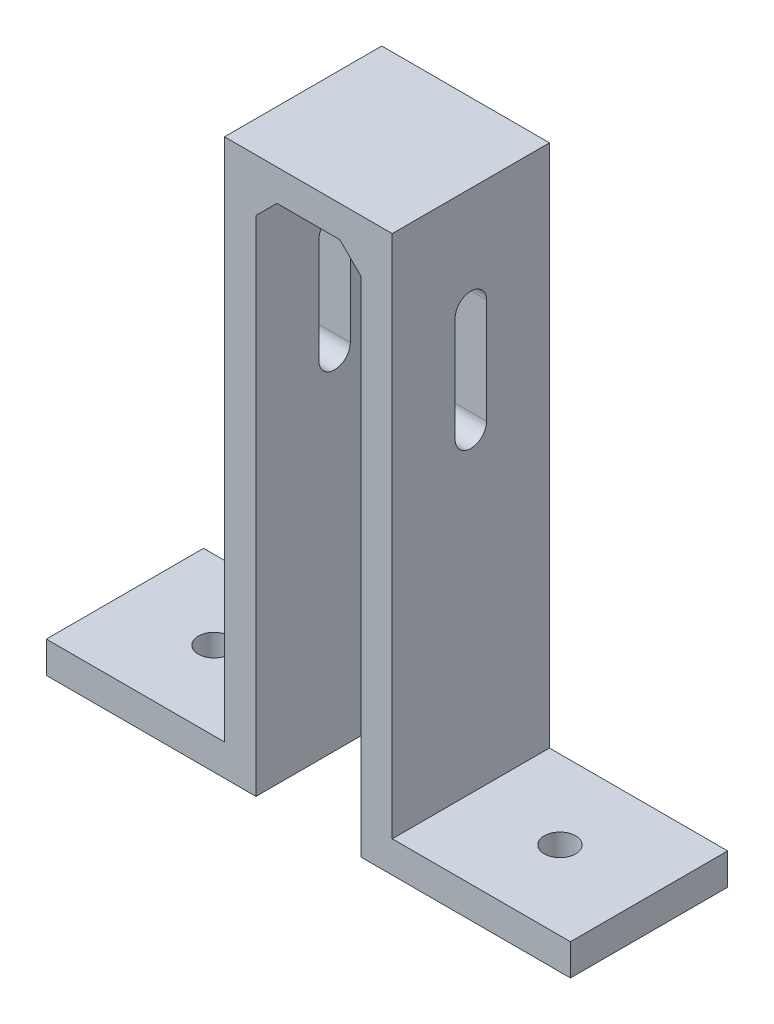
ISO-10303-21;
HEADER;
FILE_DESCRIPTION(('STEP AP214'),'2;1');
FILE_NAME('part.step','',(''),(''),'','','');
FILE_SCHEMA(('AUTOMOTIVE_DESIGN { 1 0 10303 214 1 1 1 1 }'));
ENDSEC;
DATA;
#1=APPLICATION_CONTEXT('core data for automotive mechanical design processes');
#2=APPLICATION_PROTOCOL_DEFINITION('international standard','automotive_design',2000,#1);
#3=PRODUCT_CONTEXT('',#1,'mechanical');
#4=PRODUCT('Part','Part','',(#3));
#5=PRODUCT_RELATED_PRODUCT_CATEGORY('part','',(#4));
#6=PRODUCT_DEFINITION_FORMATION('','',#4);
#7=PRODUCT_DEFINITION_CONTEXT('part definition',#1,'design');
#8=PRODUCT_DEFINITION('design','',#6,#7);
#9=PRODUCT_DEFINITION_SHAPE('','',#8);
#10=(LENGTH_UNIT() NAMED_UNIT(*) SI_UNIT(.MILLI.,.METRE.));
#11=(NAMED_UNIT(*) PLANE_ANGLE_UNIT() SI_UNIT($,.RADIAN.));
#12=(NAMED_UNIT(*) SI_UNIT($,.STERADIAN.) SOLID_ANGLE_UNIT());
#13=UNCERTAINTY_MEASURE_WITH_UNIT(LENGTH_MEASURE(1.E-05),#10,'distance_accuracy_value','');
#14=(GEOMETRIC_REPRESENTATION_CONTEXT(3) GLOBAL_UNCERTAINTY_ASSIGNED_CONTEXT((#13)) GLOBAL_UNIT_ASSIGNED_CONTEXT((#10,
#11,#12)) REPRESENTATION_CONTEXT('',''));
#15=CARTESIAN_POINT('',(0.,0.,0.));
#16=DIRECTION('',(0.,0.,1.));
#17=DIRECTION('',(1.,0.,0.));
#18=AXIS2_PLACEMENT_3D('',#15,#16,#17);
#19=CARTESIAN_POINT('',(0.,0.,15.));
#20=DIRECTION('',(0.,1.,0.));
#21=DIRECTION('',(-1.,0.,0.));
#22=AXIS2_PLACEMENT_3D('',#19,#20,#21);
#23=PLANE('',#22);
#24=CARTESIAN_POINT('',(-11.5,0.,7.5));
#25=DIRECTION('',(0.,1.,0.));
#26=DIRECTION('',(0.,0.,1.));
#27=AXIS2_PLACEMENT_3D('',#24,#25,#26);
#28=CIRCLE('',#27,1.5);
#29=CARTESIAN_POINT('',(-11.5,0.,9.));
#30=VERTEX_POINT('',#29);
#31=EDGE_CURVE('E221',#30,#30,#28,.T.);
#32=ORIENTED_EDGE('',*,*,#31,.T.);
#33=EDGE_LOOP('',(#32));
#34=FACE_BOUND('',#33,.T.);
#35=DIRECTION('',(1.,0.,0.));
#36=VECTOR('',#35,1.);
#37=CARTESIAN_POINT('',(0.,0.,0.));
#38=LINE('',#37,#36);
#39=CARTESIAN_POINT('',(-20.,0.,0.));
#40=VERTEX_POINT('',#39);
#41=CARTESIAN_POINT('',(0.,0.,0.));
#42=VERTEX_POINT('',#41);
#43=EDGE_CURVE('E303',#40,#42,#38,.T.);
#44=ORIENTED_EDGE('',*,*,#43,.T.);
#45=DIRECTION('',(0.,0.,-1.));
#46=VECTOR('',#45,1.);
#47=CARTESIAN_POINT('',(0.,0.,15.));
#48=LINE('',#47,#46);
#49=CARTESIAN_POINT('',(0.,0.,15.));
#50=VERTEX_POINT('',#49);
#51=EDGE_CURVE('E407',#50,#42,#48,.T.);
#52=ORIENTED_EDGE('',*,*,#51,.F.);
#53=DIRECTION('',(1.,0.,0.));
#54=VECTOR('',#53,1.);
#55=CARTESIAN_POINT('',(0.,0.,15.));
#56=LINE('',#55,#54);
#57=CARTESIAN_POINT('',(-20.,0.,15.));
#58=VERTEX_POINT('',#57);
#59=EDGE_CURVE('E304',#58,#50,#56,.T.);
#60=ORIENTED_EDGE('',*,*,#59,.F.);
#61=DIRECTION('',(0.,0.,-1.));
#62=VECTOR('',#61,1.);
#63=CARTESIAN_POINT('',(-20.,0.,15.));
#64=LINE('',#63,#62);
#65=EDGE_CURVE('E341',#58,#40,#64,.T.);
#66=ORIENTED_EDGE('',*,*,#65,.T.);
#67=EDGE_LOOP('',(#44,#52,#60,#66));
#68=FACE_BOUND('',#67,.T.);
#69=ADVANCED_FACE('F39',(#34,#68),#23,.F.);
#70=CARTESIAN_POINT('',(0.,0.,15.));
#71=DIRECTION('',(-1.,0.,0.));
#72=DIRECTION('',(0.,0.,1.));
#73=AXIS2_PLACEMENT_3D('',#70,#71,#72);
#74=PLANE('',#73);
#75=CARTESIAN_POINT('',(0.,33.,7.5));
#76=DIRECTION('',(-1.,0.,0.));
#77=DIRECTION('',(0.,0.,1.));
#78=AXIS2_PLACEMENT_3D('',#75,#76,#77);
#79=CIRCLE('',#78,1.5);
#80=CARTESIAN_POINT('',(0.,33.,6.));
#81=VERTEX_POINT('',#80);
#82=CARTESIAN_POINT('',(0.,33.,9.));
#83=VERTEX_POINT('',#82);
#84=EDGE_CURVE('E286',#81,#83,#79,.T.);
#85=ORIENTED_EDGE('',*,*,#84,.T.);
#86=DIRECTION('',(0.,1.,0.));
#87=VECTOR('',#86,1.);
#88=CARTESIAN_POINT('',(0.,0.,8.99999999999999));
#89=LINE('',#88,#87);
#90=CARTESIAN_POINT('',(0.,43.,9.));
#91=VERTEX_POINT('',#90);
#92=EDGE_CURVE('E278',#83,#91,#89,.T.);
#93=ORIENTED_EDGE('',*,*,#92,.T.);
#94=CARTESIAN_POINT('',(0.,43.,7.5));
#95=DIRECTION('',(-1.,0.,0.));
#96=DIRECTION('',(0.,0.,1.));
#97=AXIS2_PLACEMENT_3D('',#94,#95,#96);
#98=CIRCLE('',#97,1.5);
#99=CARTESIAN_POINT('',(0.,43.,6.));
#100=VERTEX_POINT('',#99);
#101=EDGE_CURVE('E299',#91,#100,#98,.T.);
#102=ORIENTED_EDGE('',*,*,#101,.T.);
#103=DIRECTION('',(0.,-1.,0.));
#104=VECTOR('',#103,1.);
#105=CARTESIAN_POINT('',(0.,0.,6.));
#106=LINE('',#105,#104);
#107=EDGE_CURVE('E266',#100,#81,#106,.T.);
#108=ORIENTED_EDGE('',*,*,#107,.T.);
#109=EDGE_LOOP('',(#85,#93,#102,#108));
#110=FACE_BOUND('',#109,.T.);
#111=DIRECTION('',(0.,1.,0.));
#112=VECTOR('',#111,1.);
#113=CARTESIAN_POINT('',(0.,0.,0.));
#114=LINE('',#113,#112);
#115=CARTESIAN_POINT('',(0.,48.,0.));
#116=VERTEX_POINT('',#115);
#117=EDGE_CURVE('E199',#42,#116,#114,.T.);
#118=ORIENTED_EDGE('',*,*,#117,.T.);
#119=DIRECTION('',(0.,0.,1.));
#120=VECTOR('',#119,1.);
#121=CARTESIAN_POINT('',(0.,48.,-2.82842712474619));
#122=LINE('',#121,#120);
#123=CARTESIAN_POINT('',(0.,48.,15.));
#124=VERTEX_POINT('',#123);
#125=EDGE_CURVE('E209',#116,#124,#122,.T.);
#126=ORIENTED_EDGE('',*,*,#125,.T.);
#127=DIRECTION('',(0.,1.,0.));
#128=VECTOR('',#127,1.);
#129=CARTESIAN_POINT('',(0.,0.,15.));
#130=LINE('',#129,#128);
#131=EDGE_CURVE('E308',#50,#124,#130,.T.);
#132=ORIENTED_EDGE('',*,*,#131,.F.);
#133=ORIENTED_EDGE('',*,*,#51,.T.);
#134=EDGE_LOOP('',(#118,#126,#132,#133));
#135=FACE_BOUND('',#134,.T.);
#136=ADVANCED_FACE('F454',(#110,#135),#74,.F.);
#137=CARTESIAN_POINT('',(0.,50.,15.));
#138=DIRECTION('',(0.,1.,0.));
#139=DIRECTION('',(0.,0.,1.));
#140=AXIS2_PLACEMENT_3D('',#137,#138,#139);
#141=PLANE('',#140);
#142=DIRECTION('',(1.,0.,0.));
#143=VECTOR('',#142,1.);
#144=CARTESIAN_POINT('',(0.,50.,0.));
#145=LINE('',#144,#143);
#146=CARTESIAN_POINT('',(2.,50.,0.));
#147=VERTEX_POINT('',#146);
#148=CARTESIAN_POINT('',(8.,50.,0.));
#149=VERTEX_POINT('',#148);
#150=EDGE_CURVE('E188',#147,#149,#145,.T.);
#151=ORIENTED_EDGE('',*,*,#150,.T.);
#152=DIRECTION('',(0.,0.,1.));
#153=VECTOR('',#152,1.);
#154=CARTESIAN_POINT('',(8.,50.,-2.82842712474619));
#155=LINE('',#154,#153);
#156=CARTESIAN_POINT('',(8.,50.,15.));
#157=VERTEX_POINT('',#156);
#158=EDGE_CURVE('E62',#149,#157,#155,.T.);
#159=ORIENTED_EDGE('',*,*,#158,.T.);
#160=DIRECTION('',(1.,0.,0.));
#161=VECTOR('',#160,1.);
#162=CARTESIAN_POINT('',(0.,50.,15.));
#163=LINE('',#162,#161);
#164=CARTESIAN_POINT('',(2.00000000000002,50.,15.));
#165=VERTEX_POINT('',#164);
#166=EDGE_CURVE('E204',#165,#157,#163,.T.);
#167=ORIENTED_EDGE('',*,*,#166,.F.);
#168=DIRECTION('',(0.,0.,1.));
#169=VECTOR('',#168,1.);
#170=CARTESIAN_POINT('',(2.,50.,-2.82842712474619));
#171=LINE('',#170,#169);
#172=EDGE_CURVE('E202',#147,#165,#171,.T.);
#173=ORIENTED_EDGE('',*,*,#172,.F.);
#174=EDGE_LOOP('',(#151,#159,#167,#173));
#175=FACE_BOUND('',#174,.T.);
#176=ADVANCED_FACE('F203',(#175),#141,.F.);
#177=CARTESIAN_POINT('',(10.,50.,15.));
#178=DIRECTION('',(1.,0.,0.));
#179=DIRECTION('',(0.,1.,0.));
#180=AXIS2_PLACEMENT_3D('',#177,#178,#179);
#181=PLANE('',#180);
#182=CARTESIAN_POINT('',(10.,43.,7.5));
#183=DIRECTION('',(1.,0.,0.));
#184=DIRECTION('',(0.,1.,0.));
#185=AXIS2_PLACEMENT_3D('',#182,#183,#184);
#186=CIRCLE('',#185,1.5);
#187=CARTESIAN_POINT('',(10.,43.,6.));
#188=VERTEX_POINT('',#187);
#189=CARTESIAN_POINT('',(10.,43.,9.));
#190=VERTEX_POINT('',#189);
#191=EDGE_CURVE('E295',#188,#190,#186,.T.);
#192=ORIENTED_EDGE('',*,*,#191,.T.);
#193=DIRECTION('',(0.,-1.,0.));
#194=VECTOR('',#193,1.);
#195=CARTESIAN_POINT('',(10.,50.,9.));
#196=LINE('',#195,#194);
#197=CARTESIAN_POINT('',(10.,33.,9.));
#198=VERTEX_POINT('',#197);
#199=EDGE_CURVE('E274',#190,#198,#196,.T.);
#200=ORIENTED_EDGE('',*,*,#199,.T.);
#201=CARTESIAN_POINT('',(10.,33.,7.5));
#202=DIRECTION('',(1.,0.,0.));
#203=DIRECTION('',(0.,1.,0.));
#204=AXIS2_PLACEMENT_3D('',#201,#202,#203);
#205=CIRCLE('',#204,1.5);
#206=CARTESIAN_POINT('',(10.,33.,6.));
#207=VERTEX_POINT('',#206);
#208=EDGE_CURVE('E282',#198,#207,#205,.T.);
#209=ORIENTED_EDGE('',*,*,#208,.T.);
#210=DIRECTION('',(0.,1.,0.));
#211=VECTOR('',#210,1.);
#212=CARTESIAN_POINT('',(10.,50.,6.));
#213=LINE('',#212,#211);
#214=EDGE_CURVE('E262',#207,#188,#213,.T.);
#215=ORIENTED_EDGE('',*,*,#214,.T.);
#216=EDGE_LOOP('',(#192,#200,#209,#215));
#217=FACE_BOUND('',#216,.T.);
#218=DIRECTION('',(0.,-1.,0.));
#219=VECTOR('',#218,1.);
#220=CARTESIAN_POINT('',(10.,50.,15.));
#221=LINE('',#220,#219);
#222=CARTESIAN_POINT('',(9.99999999999999,48.,15.));
#223=VERTEX_POINT('',#222);
#224=CARTESIAN_POINT('',(10.,0.,15.));
#225=VERTEX_POINT('',#224);
#226=EDGE_CURVE('E54',#223,#225,#221,.T.);
#227=ORIENTED_EDGE('',*,*,#226,.F.);
#228=DIRECTION('',(0.,0.,1.));
#229=VECTOR('',#228,1.);
#230=CARTESIAN_POINT('',(10.,48.,-2.82842712474619));
#231=LINE('',#230,#229);
#232=CARTESIAN_POINT('',(9.99999999999999,48.,0.));
#233=VERTEX_POINT('',#232);
#234=EDGE_CURVE('E510',#233,#223,#231,.T.);
#235=ORIENTED_EDGE('',*,*,#234,.F.);
#236=DIRECTION('',(0.,-1.,0.));
#237=VECTOR('',#236,1.);
#238=CARTESIAN_POINT('',(10.,50.,0.));
#239=LINE('',#238,#237);
#240=CARTESIAN_POINT('',(10.,0.,0.));
#241=VERTEX_POINT('',#240);
#242=EDGE_CURVE('E198',#233,#241,#239,.T.);
#243=ORIENTED_EDGE('',*,*,#242,.T.);
#244=DIRECTION('',(0.,0.,-1.));
#245=VECTOR('',#244,1.);
#246=CARTESIAN_POINT('',(10.,0.,15.));
#247=LINE('',#246,#245);
#248=EDGE_CURVE('E403',#225,#241,#247,.T.);
#249=ORIENTED_EDGE('',*,*,#248,.F.);
#250=EDGE_LOOP('',(#227,#235,#243,#249));
#251=FACE_BOUND('',#250,.T.);
#252=ADVANCED_FACE('F426',(#217,#251),#181,.F.);
#253=CARTESIAN_POINT('',(10.,0.,15.));
#254=DIRECTION('',(0.,1.,0.));
#255=DIRECTION('',(0.,0.,1.));
#256=AXIS2_PLACEMENT_3D('',#253,#254,#255);
#257=PLANE('',#256);
#258=CARTESIAN_POINT('',(21.5,0.,7.5));
#259=DIRECTION('',(0.,1.,0.));
#260=DIRECTION('',(0.,0.,1.));
#261=AXIS2_PLACEMENT_3D('',#258,#259,#260);
#262=CIRCLE('',#261,1.5);
#263=CARTESIAN_POINT('',(21.5,0.,9.));
#264=VERTEX_POINT('',#263);
#265=EDGE_CURVE('E217',#264,#264,#262,.T.);
#266=ORIENTED_EDGE('',*,*,#265,.T.);
#267=EDGE_LOOP('',(#266));
#268=FACE_BOUND('',#267,.T.);
#269=DIRECTION('',(1.,0.,0.));
#270=VECTOR('',#269,1.);
#271=CARTESIAN_POINT('',(10.,0.,0.));
#272=LINE('',#271,#270);
#273=CARTESIAN_POINT('',(30.,0.,0.));
#274=VERTEX_POINT('',#273);
#275=EDGE_CURVE('E349',#241,#274,#272,.T.);
#276=ORIENTED_EDGE('',*,*,#275,.T.);
#277=DIRECTION('',(0.,0.,-1.));
#278=VECTOR('',#277,1.);
#279=CARTESIAN_POINT('',(30.,0.,15.));
#280=LINE('',#279,#278);
#281=CARTESIAN_POINT('',(30.,0.,15.));
#282=VERTEX_POINT('',#281);
#283=EDGE_CURVE('E399',#282,#274,#280,.T.);
#284=ORIENTED_EDGE('',*,*,#283,.F.);
#285=DIRECTION('',(1.,0.,0.));
#286=VECTOR('',#285,1.);
#287=CARTESIAN_POINT('',(10.,0.,15.));
#288=LINE('',#287,#286);
#289=EDGE_CURVE('E317',#225,#282,#288,.T.);
#290=ORIENTED_EDGE('',*,*,#289,.F.);
#291=ORIENTED_EDGE('',*,*,#248,.T.);
#292=EDGE_LOOP('',(#276,#284,#290,#291));
#293=FACE_BOUND('',#292,.T.);
#294=ADVANCED_FACE('F506',(#268,#293),#257,.F.);
#295=CARTESIAN_POINT('',(30.,3.,15.));
#296=DIRECTION('',(-1.,0.,0.));
#297=DIRECTION('',(0.,0.,1.));
#298=AXIS2_PLACEMENT_3D('',#295,#296,#297);
#299=PLANE('',#298);
#300=DIRECTION('',(0.,1.,0.));
#301=VECTOR('',#300,1.);
#302=CARTESIAN_POINT('',(30.,3.,0.));
#303=LINE('',#302,#301);
#304=CARTESIAN_POINT('',(30.,3.,0.));
#305=VERTEX_POINT('',#304);
#306=EDGE_CURVE('E352',#274,#305,#303,.T.);
#307=ORIENTED_EDGE('',*,*,#306,.T.);
#308=DIRECTION('',(0.,0.,-1.));
#309=VECTOR('',#308,1.);
#310=CARTESIAN_POINT('',(30.,3.,15.));
#311=LINE('',#310,#309);
#312=CARTESIAN_POINT('',(30.,3.,15.));
#313=VERTEX_POINT('',#312);
#314=EDGE_CURVE('E395',#313,#305,#311,.T.);
#315=ORIENTED_EDGE('',*,*,#314,.F.);
#316=DIRECTION('',(0.,1.,0.));
#317=VECTOR('',#316,1.);
#318=CARTESIAN_POINT('',(30.,3.,15.));
#319=LINE('',#318,#317);
#320=EDGE_CURVE('E320',#282,#313,#319,.T.);
#321=ORIENTED_EDGE('',*,*,#320,.F.);
#322=ORIENTED_EDGE('',*,*,#283,.T.);
#323=EDGE_LOOP('',(#307,#315,#321,#322));
#324=FACE_BOUND('',#323,.T.);
#325=ADVANCED_FACE('F502',(#324),#299,.F.);
#326=CARTESIAN_POINT('',(13.,3.,15.));
#327=DIRECTION('',(0.,-1.,0.));
#328=DIRECTION('',(0.,0.,-1.));
#329=AXIS2_PLACEMENT_3D('',#326,#327,#328);
#330=PLANE('',#329);
#331=CARTESIAN_POINT('',(21.5,3.,7.5));
#332=DIRECTION('',(0.,1.,0.));
#333=DIRECTION('',(0.,0.,1.));
#334=AXIS2_PLACEMENT_3D('',#331,#332,#333);
#335=CIRCLE('',#334,1.5);
#336=CARTESIAN_POINT('',(21.5,3.,9.));
#337=VERTEX_POINT('',#336);
#338=EDGE_CURVE('E213',#337,#337,#335,.T.);
#339=ORIENTED_EDGE('',*,*,#338,.F.);
#340=EDGE_LOOP('',(#339));
#341=FACE_BOUND('',#340,.T.);
#342=DIRECTION('',(-1.,0.,0.));
#343=VECTOR('',#342,1.);
#344=CARTESIAN_POINT('',(13.,3.,0.));
#345=LINE('',#344,#343);
#346=CARTESIAN_POINT('',(13.,3.,0.));
#347=VERTEX_POINT('',#346);
#348=EDGE_CURVE('E355',#305,#347,#345,.T.);
#349=ORIENTED_EDGE('',*,*,#348,.T.);
#350=DIRECTION('',(0.,0.,-1.));
#351=VECTOR('',#350,1.);
#352=CARTESIAN_POINT('',(13.,3.,15.));
#353=LINE('',#352,#351);
#354=CARTESIAN_POINT('',(13.,3.,15.));
#355=VERTEX_POINT('',#354);
#356=EDGE_CURVE('E391',#355,#347,#353,.T.);
#357=ORIENTED_EDGE('',*,*,#356,.F.);
#358=DIRECTION('',(-1.,0.,0.));
#359=VECTOR('',#358,1.);
#360=CARTESIAN_POINT('',(13.,3.,15.));
#361=LINE('',#360,#359);
#362=EDGE_CURVE('E323',#313,#355,#361,.T.);
#363=ORIENTED_EDGE('',*,*,#362,.F.);
#364=ORIENTED_EDGE('',*,*,#314,.T.);
#365=EDGE_LOOP('',(#349,#357,#363,#364));
#366=FACE_BOUND('',#365,.T.);
#367=ADVANCED_FACE('F497',(#341,#366),#330,.F.);
#368=CARTESIAN_POINT('',(13.,53.,15.));
#369=DIRECTION('',(-1.,0.,0.));
#370=DIRECTION('',(0.,-1.,0.));
#371=AXIS2_PLACEMENT_3D('',#368,#369,#370);
#372=PLANE('',#371);
#373=CARTESIAN_POINT('',(13.,33.,7.5));
#374=DIRECTION('',(1.,0.,0.));
#375=DIRECTION('',(0.,1.,0.));
#376=AXIS2_PLACEMENT_3D('',#373,#374,#375);
#377=CIRCLE('',#376,1.5);
#378=CARTESIAN_POINT('',(13.,33.,9.));
#379=VERTEX_POINT('',#378);
#380=CARTESIAN_POINT('',(13.,33.,6.));
#381=VERTEX_POINT('',#380);
#382=EDGE_CURVE('E236',#379,#381,#377,.T.);
#383=ORIENTED_EDGE('',*,*,#382,.F.);
#384=DIRECTION('',(0.,-1.,0.));
#385=VECTOR('',#384,1.);
#386=CARTESIAN_POINT('',(13.,0.,8.99999999999999));
#387=LINE('',#386,#385);
#388=CARTESIAN_POINT('',(13.,43.,9.));
#389=VERTEX_POINT('',#388);
#390=EDGE_CURVE('E225',#389,#379,#387,.T.);
#391=ORIENTED_EDGE('',*,*,#390,.F.);
#392=CARTESIAN_POINT('',(13.,43.,7.5));
#393=DIRECTION('',(1.,0.,0.));
#394=DIRECTION('',(0.,1.,0.));
#395=AXIS2_PLACEMENT_3D('',#392,#393,#394);
#396=CIRCLE('',#395,1.5);
#397=CARTESIAN_POINT('',(13.,43.,6.));
#398=VERTEX_POINT('',#397);
#399=EDGE_CURVE('E290',#398,#389,#396,.T.);
#400=ORIENTED_EDGE('',*,*,#399,.F.);
#401=DIRECTION('',(0.,1.,0.));
#402=VECTOR('',#401,1.);
#403=CARTESIAN_POINT('',(13.,0.,6.));
#404=LINE('',#403,#402);
#405=EDGE_CURVE('E240',#381,#398,#404,.T.);
#406=ORIENTED_EDGE('',*,*,#405,.F.);
#407=EDGE_LOOP('',(#383,#391,#400,#406));
#408=FACE_BOUND('',#407,.T.);
#409=DIRECTION('',(0.,1.,0.));
#410=VECTOR('',#409,1.);
#411=CARTESIAN_POINT('',(13.,53.,0.));
#412=LINE('',#411,#410);
#413=CARTESIAN_POINT('',(13.,53.,0.));
#414=VERTEX_POINT('',#413);
#415=EDGE_CURVE('E358',#347,#414,#412,.T.);
#416=ORIENTED_EDGE('',*,*,#415,.T.);
#417=DIRECTION('',(0.,0.,-1.));
#418=VECTOR('',#417,1.);
#419=CARTESIAN_POINT('',(13.,53.,15.));
#420=LINE('',#419,#418);
#421=CARTESIAN_POINT('',(13.,53.,15.));
#422=VERTEX_POINT('',#421);
#423=EDGE_CURVE('E387',#422,#414,#420,.T.);
#424=ORIENTED_EDGE('',*,*,#423,.F.);
#425=DIRECTION('',(0.,1.,0.));
#426=VECTOR('',#425,1.);
#427=CARTESIAN_POINT('',(13.,53.,15.));
#428=LINE('',#427,#426);
#429=EDGE_CURVE('E326',#355,#422,#428,.T.);
#430=ORIENTED_EDGE('',*,*,#429,.F.);
#431=ORIENTED_EDGE('',*,*,#356,.T.);
#432=EDGE_LOOP('',(#416,#424,#430,#431));
#433=FACE_BOUND('',#432,.T.);
#434=ADVANCED_FACE('F436',(#408,#433),#372,.F.);
#435=CARTESIAN_POINT('',(-3.,53.,15.));
#436=DIRECTION('',(0.,-1.,0.));
#437=DIRECTION('',(0.,0.,-1.));
#438=AXIS2_PLACEMENT_3D('',#435,#436,#437);
#439=PLANE('',#438);
#440=DIRECTION('',(-1.,0.,0.));
#441=VECTOR('',#440,1.);
#442=CARTESIAN_POINT('',(-3.,53.,0.));
#443=LINE('',#442,#441);
#444=CARTESIAN_POINT('',(-3.,53.,0.));
#445=VERTEX_POINT('',#444);
#446=EDGE_CURVE('E361',#414,#445,#443,.T.);
#447=ORIENTED_EDGE('',*,*,#446,.T.);
#448=DIRECTION('',(0.,0.,-1.));
#449=VECTOR('',#448,1.);
#450=CARTESIAN_POINT('',(-3.,53.,15.));
#451=LINE('',#450,#449);
#452=CARTESIAN_POINT('',(-3.,53.,15.));
#453=VERTEX_POINT('',#452);
#454=EDGE_CURVE('E383',#453,#445,#451,.T.);
#455=ORIENTED_EDGE('',*,*,#454,.F.);
#456=DIRECTION('',(-1.,0.,0.));
#457=VECTOR('',#456,1.);
#458=CARTESIAN_POINT('',(-3.,53.,15.));
#459=LINE('',#458,#457);
#460=EDGE_CURVE('E329',#422,#453,#459,.T.);
#461=ORIENTED_EDGE('',*,*,#460,.F.);
#462=ORIENTED_EDGE('',*,*,#423,.T.);
#463=EDGE_LOOP('',(#447,#455,#461,#462));
#464=FACE_BOUND('',#463,.T.);
#465=ADVANCED_FACE('F489',(#464),#439,.F.);
#466=CARTESIAN_POINT('',(-3.,3.,15.));
#467=DIRECTION('',(1.,0.,0.));
#468=DIRECTION('',(0.,0.,-1.));
#469=AXIS2_PLACEMENT_3D('',#466,#467,#468);
#470=PLANE('',#469);
#471=CARTESIAN_POINT('',(-3.,43.,7.5));
#472=DIRECTION('',(1.,0.,0.));
#473=DIRECTION('',(0.,0.,-1.));
#474=AXIS2_PLACEMENT_3D('',#471,#472,#473);
#475=CIRCLE('',#474,1.5);
#476=CARTESIAN_POINT('',(-3.,43.,6.));
#477=VERTEX_POINT('',#476);
#478=CARTESIAN_POINT('',(-3.,43.,9.));
#479=VERTEX_POINT('',#478);
#480=EDGE_CURVE('E294',#477,#479,#475,.T.);
#481=ORIENTED_EDGE('',*,*,#480,.T.);
#482=DIRECTION('',(0.,-1.,0.));
#483=VECTOR('',#482,1.);
#484=CARTESIAN_POINT('',(-3.,3.,8.99999999999999));
#485=LINE('',#484,#483);
#486=CARTESIAN_POINT('',(-3.,33.,9.));
#487=VERTEX_POINT('',#486);
#488=EDGE_CURVE('E270',#479,#487,#485,.T.);
#489=ORIENTED_EDGE('',*,*,#488,.T.);
#490=CARTESIAN_POINT('',(-3.,33.,7.5));
#491=DIRECTION('',(1.,0.,0.));
#492=DIRECTION('',(0.,0.,-1.));
#493=AXIS2_PLACEMENT_3D('',#490,#491,#492);
#494=CIRCLE('',#493,1.5);
#495=CARTESIAN_POINT('',(-3.,33.,6.));
#496=VERTEX_POINT('',#495);
#497=EDGE_CURVE('E11',#487,#496,#494,.T.);
#498=ORIENTED_EDGE('',*,*,#497,.T.);
#499=DIRECTION('',(0.,1.,0.));
#500=VECTOR('',#499,1.);
#501=CARTESIAN_POINT('',(-3.,3.,6.));
#502=LINE('',#501,#500);
#503=EDGE_CURVE('E247',#496,#477,#502,.T.);
#504=ORIENTED_EDGE('',*,*,#503,.T.);
#505=EDGE_LOOP('',(#481,#489,#498,#504));
#506=FACE_BOUND('',#505,.T.);
#507=DIRECTION('',(0.,-1.,0.));
#508=VECTOR('',#507,1.);
#509=CARTESIAN_POINT('',(-3.,3.,0.));
#510=LINE('',#509,#508);
#511=CARTESIAN_POINT('',(-3.,3.,0.));
#512=VERTEX_POINT('',#511);
#513=EDGE_CURVE('E364',#445,#512,#510,.T.);
#514=ORIENTED_EDGE('',*,*,#513,.T.);
#515=DIRECTION('',(0.,0.,-1.));
#516=VECTOR('',#515,1.);
#517=CARTESIAN_POINT('',(-3.,3.,15.));
#518=LINE('',#517,#516);
#519=CARTESIAN_POINT('',(-3.,3.,15.));
#520=VERTEX_POINT('',#519);
#521=EDGE_CURVE('E379',#520,#512,#518,.T.);
#522=ORIENTED_EDGE('',*,*,#521,.F.);
#523=DIRECTION('',(0.,-1.,0.));
#524=VECTOR('',#523,1.);
#525=CARTESIAN_POINT('',(-3.,3.,15.));
#526=LINE('',#525,#524);
#527=EDGE_CURVE('E332',#453,#520,#526,.T.);
#528=ORIENTED_EDGE('',*,*,#527,.F.);
#529=ORIENTED_EDGE('',*,*,#454,.T.);
#530=EDGE_LOOP('',(#514,#522,#528,#529));
#531=FACE_BOUND('',#530,.T.);
#532=ADVANCED_FACE('F484',(#506,#531),#470,.F.);
#533=CARTESIAN_POINT('',(-3.,3.,15.));
#534=DIRECTION('',(0.,-1.,0.));
#535=DIRECTION('',(0.,0.,-1.));
#536=AXIS2_PLACEMENT_3D('',#533,#534,#535);
#537=PLANE('',#536);
#538=CARTESIAN_POINT('',(-11.5,3.,7.5));
#539=DIRECTION('',(0.,1.,0.));
#540=DIRECTION('',(0.,0.,1.));
#541=AXIS2_PLACEMENT_3D('',#538,#539,#540);
#542=CIRCLE('',#541,1.5);
#543=CARTESIAN_POINT('',(-11.5,3.,9.));
#544=VERTEX_POINT('',#543);
#545=EDGE_CURVE('E226',#544,#544,#542,.T.);
#546=ORIENTED_EDGE('',*,*,#545,.F.);
#547=EDGE_LOOP('',(#546));
#548=FACE_BOUND('',#547,.T.);
#549=DIRECTION('',(-1.,0.,0.));
#550=VECTOR('',#549,1.);
#551=CARTESIAN_POINT('',(-3.,3.,0.));
#552=LINE('',#551,#550);
#553=CARTESIAN_POINT('',(-20.,3.,0.));
#554=VERTEX_POINT('',#553);
#555=EDGE_CURVE('E367',#512,#554,#552,.T.);
#556=ORIENTED_EDGE('',*,*,#555,.T.);
#557=DIRECTION('',(0.,0.,-1.));
#558=VECTOR('',#557,1.);
#559=CARTESIAN_POINT('',(-20.,3.,15.));
#560=LINE('',#559,#558);
#561=CARTESIAN_POINT('',(-20.,3.,15.));
#562=VERTEX_POINT('',#561);
#563=EDGE_CURVE('E375',#562,#554,#560,.T.);
#564=ORIENTED_EDGE('',*,*,#563,.F.);
#565=DIRECTION('',(-1.,0.,0.));
#566=VECTOR('',#565,1.);
#567=CARTESIAN_POINT('',(-3.,3.,15.));
#568=LINE('',#567,#566);
#569=EDGE_CURVE('E335',#520,#562,#568,.T.);
#570=ORIENTED_EDGE('',*,*,#569,.F.);
#571=ORIENTED_EDGE('',*,*,#521,.T.);
#572=EDGE_LOOP('',(#556,#564,#570,#571));
#573=FACE_BOUND('',#572,.T.);
#574=ADVANCED_FACE('F478',(#548,#573),#537,.F.);
#575=CARTESIAN_POINT('',(-20.,3.,15.));
#576=DIRECTION('',(1.,0.,0.));
#577=DIRECTION('',(0.,0.,-1.));
#578=AXIS2_PLACEMENT_3D('',#575,#576,#577);
#579=PLANE('',#578);
#580=DIRECTION('',(0.,-1.,0.));
#581=VECTOR('',#580,1.);
#582=CARTESIAN_POINT('',(-20.,3.,0.));
#583=LINE('',#582,#581);
#584=EDGE_CURVE('E309',#554,#40,#583,.T.);
#585=ORIENTED_EDGE('',*,*,#584,.T.);
#586=ORIENTED_EDGE('',*,*,#65,.F.);
#587=DIRECTION('',(0.,-1.,0.));
#588=VECTOR('',#587,1.);
#589=CARTESIAN_POINT('',(-20.,3.,15.));
#590=LINE('',#589,#588);
#591=EDGE_CURVE('E338',#562,#58,#590,.T.);
#592=ORIENTED_EDGE('',*,*,#591,.F.);
#593=ORIENTED_EDGE('',*,*,#563,.T.);
#594=EDGE_LOOP('',(#585,#586,#592,#593));
#595=FACE_BOUND('',#594,.T.);
#596=ADVANCED_FACE('F476',(#595),#579,.F.);
#597=CARTESIAN_POINT('',(0.,0.,15.));
#598=DIRECTION('',(0.,0.,1.));
#599=DIRECTION('',(1.,0.,0.));
#600=AXIS2_PLACEMENT_3D('',#597,#598,#599);
#601=PLANE('',#600);
#602=DIRECTION('',(0.707106781186547,-0.707106781186548,0.));
#603=VECTOR('',#602,1.);
#604=CARTESIAN_POINT('',(8.,50.,15.));
#605=LINE('',#604,#603);
#606=EDGE_CURVE('E519',#157,#223,#605,.T.);
#607=ORIENTED_EDGE('',*,*,#606,.T.);
#608=ORIENTED_EDGE('',*,*,#226,.T.);
#609=ORIENTED_EDGE('',*,*,#289,.T.);
#610=ORIENTED_EDGE('',*,*,#320,.T.);
#611=ORIENTED_EDGE('',*,*,#362,.T.);
#612=ORIENTED_EDGE('',*,*,#429,.T.);
#613=ORIENTED_EDGE('',*,*,#460,.T.);
#614=ORIENTED_EDGE('',*,*,#527,.T.);
#615=ORIENTED_EDGE('',*,*,#569,.T.);
#616=ORIENTED_EDGE('',*,*,#591,.T.);
#617=ORIENTED_EDGE('',*,*,#59,.T.);
#618=ORIENTED_EDGE('',*,*,#131,.T.);
#619=DIRECTION('',(0.707106781186547,0.707106781186548,0.));
#620=VECTOR('',#619,1.);
#621=CARTESIAN_POINT('',(2.,50.,15.));
#622=LINE('',#621,#620);
#623=EDGE_CURVE('E512',#124,#165,#622,.T.);
#624=ORIENTED_EDGE('',*,*,#623,.T.);
#625=ORIENTED_EDGE('',*,*,#166,.T.);
#626=EDGE_LOOP('',(#607,#608,#609,#610,#611,#612,#613,#614,#615,#616,#617,#618,#624,#625));
#627=FACE_BOUND('',#626,.T.);
#628=ADVANCED_FACE('F471',(#627),#601,.T.);
#629=CARTESIAN_POINT('',(0.,0.,0.));
#630=DIRECTION('',(0.,0.,1.));
#631=DIRECTION('',(1.,0.,0.));
#632=AXIS2_PLACEMENT_3D('',#629,#630,#631);
#633=PLANE('',#632);
#634=ORIENTED_EDGE('',*,*,#242,.F.);
#635=DIRECTION('',(-0.707106781186547,0.707106781186548,0.));
#636=VECTOR('',#635,1.);
#637=CARTESIAN_POINT('',(8.,50.,0.));
#638=LINE('',#637,#636);
#639=EDGE_CURVE('E196',#233,#149,#638,.T.);
#640=ORIENTED_EDGE('',*,*,#639,.T.);
#641=ORIENTED_EDGE('',*,*,#150,.F.);
#642=DIRECTION('',(-0.707106781186547,-0.707106781186548,0.));
#643=VECTOR('',#642,1.);
#644=CARTESIAN_POINT('',(2.,50.,0.));
#645=LINE('',#644,#643);
#646=EDGE_CURVE('E193',#147,#116,#645,.T.);
#647=ORIENTED_EDGE('',*,*,#646,.T.);
#648=ORIENTED_EDGE('',*,*,#117,.F.);
#649=ORIENTED_EDGE('',*,*,#43,.F.);
#650=ORIENTED_EDGE('',*,*,#584,.F.);
#651=ORIENTED_EDGE('',*,*,#555,.F.);
#652=ORIENTED_EDGE('',*,*,#513,.F.);
#653=ORIENTED_EDGE('',*,*,#446,.F.);
#654=ORIENTED_EDGE('',*,*,#415,.F.);
#655=ORIENTED_EDGE('',*,*,#348,.F.);
#656=ORIENTED_EDGE('',*,*,#306,.F.);
#657=ORIENTED_EDGE('',*,*,#275,.F.);
#658=EDGE_LOOP('',(#634,#640,#641,#647,#648,#649,#650,#651,#652,#653,#654,#655,#656,#657));
#659=FACE_BOUND('',#658,.T.);
#660=ADVANCED_FACE('F191',(#659),#633,.F.);
#661=CARTESIAN_POINT('',(-20.,43.,7.5));
#662=DIRECTION('',(1.,0.,0.));
#663=DIRECTION('',(0.,1.,0.));
#664=AXIS2_PLACEMENT_3D('',#661,#662,#663);
#665=CYLINDRICAL_SURFACE('',#664,1.5);
#666=ORIENTED_EDGE('',*,*,#101,.F.);
#667=DIRECTION('',(1.,0.,0.));
#668=VECTOR('',#667,1.);
#669=CARTESIAN_POINT('',(-20.,43.,9.));
#670=LINE('',#669,#668);
#671=EDGE_CURVE('E244',#479,#91,#670,.T.);
#672=ORIENTED_EDGE('',*,*,#671,.F.);
#673=ORIENTED_EDGE('',*,*,#480,.F.);
#674=DIRECTION('',(1.,0.,0.));
#675=VECTOR('',#674,1.);
#676=CARTESIAN_POINT('',(-20.,43.,6.));
#677=LINE('',#676,#675);
#678=EDGE_CURVE('E248',#477,#100,#677,.T.);
#679=ORIENTED_EDGE('',*,*,#678,.T.);
#680=EDGE_LOOP('',(#666,#672,#673,#679));
#681=FACE_BOUND('',#680,.T.);
#682=ADVANCED_FACE('F552',(#681),#665,.F.);
#683=ORIENTED_EDGE('',*,*,#399,.T.);
#684=DIRECTION('',(1.,0.,0.));
#685=VECTOR('',#684,1.);
#686=CARTESIAN_POINT('',(-20.,43.,9.));
#687=LINE('',#686,#685);
#688=EDGE_CURVE('E47',#389,#190,#687,.F.);
#689=ORIENTED_EDGE('',*,*,#688,.T.);
#690=ORIENTED_EDGE('',*,*,#191,.F.);
#691=DIRECTION('',(1.,0.,0.));
#692=VECTOR('',#691,1.);
#693=CARTESIAN_POINT('',(-20.,43.,6.));
#694=LINE('',#693,#692);
#695=EDGE_CURVE('E411',#398,#188,#694,.F.);
#696=ORIENTED_EDGE('',*,*,#695,.F.);
#697=EDGE_LOOP('',(#683,#689,#690,#696));
#698=FACE_BOUND('',#697,.T.);
#699=ADVANCED_FACE('F420',(#698),#665,.F.);
#700=CARTESIAN_POINT('',(-20.,0.,6.));
#701=DIRECTION('',(0.,0.,-1.));
#702=DIRECTION('',(-1.,0.,0.));
#703=AXIS2_PLACEMENT_3D('',#700,#701,#702);
#704=PLANE('',#703);
#705=DIRECTION('',(1.,0.,0.));
#706=VECTOR('',#705,1.);
#707=CARTESIAN_POINT('',(-20.,33.,6.));
#708=LINE('',#707,#706);
#709=EDGE_CURVE('E253',#207,#381,#708,.T.);
#710=ORIENTED_EDGE('',*,*,#709,.T.);
#711=ORIENTED_EDGE('',*,*,#405,.T.);
#712=ORIENTED_EDGE('',*,*,#695,.T.);
#713=ORIENTED_EDGE('',*,*,#214,.F.);
#714=EDGE_LOOP('',(#710,#711,#712,#713));
#715=FACE_BOUND('',#714,.T.);
#716=ADVANCED_FACE('F429',(#715),#704,.F.);
#717=CARTESIAN_POINT('',(-20.,0.,8.99999999999999));
#718=DIRECTION('',(0.,0.,1.));
#719=DIRECTION('',(0.,-1.,0.));
#720=AXIS2_PLACEMENT_3D('',#717,#718,#719);
#721=PLANE('',#720);
#722=ORIENTED_EDGE('',*,*,#688,.F.);
#723=ORIENTED_EDGE('',*,*,#390,.T.);
#724=DIRECTION('',(1.,0.,0.));
#725=VECTOR('',#724,1.);
#726=CARTESIAN_POINT('',(-20.,33.,9.));
#727=LINE('',#726,#725);
#728=EDGE_CURVE('E243',#198,#379,#727,.T.);
#729=ORIENTED_EDGE('',*,*,#728,.F.);
#730=ORIENTED_EDGE('',*,*,#199,.F.);
#731=EDGE_LOOP('',(#722,#723,#729,#730));
#732=FACE_BOUND('',#731,.T.);
#733=ADVANCED_FACE('F438',(#732),#721,.F.);
#734=CARTESIAN_POINT('',(-20.,33.,7.5));
#735=DIRECTION('',(1.,0.,0.));
#736=DIRECTION('',(0.,1.,0.));
#737=AXIS2_PLACEMENT_3D('',#734,#735,#736);
#738=CYLINDRICAL_SURFACE('',#737,1.5);
#739=ORIENTED_EDGE('',*,*,#728,.T.);
#740=ORIENTED_EDGE('',*,*,#382,.T.);
#741=ORIENTED_EDGE('',*,*,#709,.F.);
#742=ORIENTED_EDGE('',*,*,#208,.F.);
#743=EDGE_LOOP('',(#739,#740,#741,#742));
#744=FACE_BOUND('',#743,.T.);
#745=ADVANCED_FACE('F431',(#744),#738,.F.);
#746=EDGE_CURVE('E252',#496,#81,#708,.T.);
#747=ORIENTED_EDGE('',*,*,#746,.F.);
#748=ORIENTED_EDGE('',*,*,#497,.F.);
#749=EDGE_CURVE('E256',#487,#83,#727,.T.);
#750=ORIENTED_EDGE('',*,*,#749,.T.);
#751=ORIENTED_EDGE('',*,*,#84,.F.);
#752=EDGE_LOOP('',(#747,#748,#750,#751));
#753=FACE_BOUND('',#752,.T.);
#754=ADVANCED_FACE('F446',(#753),#738,.F.);
#755=ORIENTED_EDGE('',*,*,#749,.F.);
#756=ORIENTED_EDGE('',*,*,#488,.F.);
#757=ORIENTED_EDGE('',*,*,#671,.T.);
#758=ORIENTED_EDGE('',*,*,#92,.F.);
#759=EDGE_LOOP('',(#755,#756,#757,#758));
#760=FACE_BOUND('',#759,.T.);
#761=ADVANCED_FACE('F441',(#760),#721,.F.);
#762=ORIENTED_EDGE('',*,*,#678,.F.);
#763=ORIENTED_EDGE('',*,*,#503,.F.);
#764=ORIENTED_EDGE('',*,*,#746,.T.);
#765=ORIENTED_EDGE('',*,*,#107,.F.);
#766=EDGE_LOOP('',(#762,#763,#764,#765));
#767=FACE_BOUND('',#766,.T.);
#768=ADVANCED_FACE('F449',(#767),#704,.F.);
#769=CARTESIAN_POINT('',(-11.5,0.,7.5));
#770=DIRECTION('',(0.,1.,0.));
#771=DIRECTION('',(0.,0.,1.));
#772=AXIS2_PLACEMENT_3D('',#769,#770,#771);
#773=CYLINDRICAL_SURFACE('',#772,1.5);
#774=ORIENTED_EDGE('',*,*,#31,.F.);
#775=EDGE_LOOP('',(#774));
#776=FACE_BOUND('',#775,.T.);
#777=ORIENTED_EDGE('',*,*,#545,.T.);
#778=EDGE_LOOP('',(#777));
#779=FACE_BOUND('',#778,.T.);
#780=ADVANCED_FACE('F571',(#776,#779),#773,.F.);
#781=CARTESIAN_POINT('',(21.5,0.,7.5));
#782=DIRECTION('',(0.,1.,0.));
#783=DIRECTION('',(0.,0.,1.));
#784=AXIS2_PLACEMENT_3D('',#781,#782,#783);
#785=CYLINDRICAL_SURFACE('',#784,1.5);
#786=ORIENTED_EDGE('',*,*,#265,.F.);
#787=EDGE_LOOP('',(#786));
#788=FACE_BOUND('',#787,.T.);
#789=ORIENTED_EDGE('',*,*,#338,.T.);
#790=EDGE_LOOP('',(#789));
#791=FACE_BOUND('',#790,.T.);
#792=ADVANCED_FACE('F575',(#788,#791),#785,.F.);
#793=CARTESIAN_POINT('',(2.,50.,-2.82842712474619));
#794=DIRECTION('',(0.707106781186548,-0.707106781186547,0.));
#795=DIRECTION('',(0.707106781186547,0.707106781186548,0.));
#796=AXIS2_PLACEMENT_3D('',#793,#794,#795);
#797=PLANE('',#796);
#798=ORIENTED_EDGE('',*,*,#646,.F.);
#799=ORIENTED_EDGE('',*,*,#172,.T.);
#800=ORIENTED_EDGE('',*,*,#623,.F.);
#801=ORIENTED_EDGE('',*,*,#125,.F.);
#802=EDGE_LOOP('',(#798,#799,#800,#801));
#803=FACE_BOUND('',#802,.T.);
#804=ADVANCED_FACE('F211',(#803),#797,.T.);
#805=CARTESIAN_POINT('',(8.,50.,-2.82842712474619));
#806=DIRECTION('',(-0.707106781186548,-0.707106781186547,0.));
#807=DIRECTION('',(0.707106781186547,-0.707106781186548,0.));
#808=AXIS2_PLACEMENT_3D('',#805,#806,#807);
#809=PLANE('',#808);
#810=ORIENTED_EDGE('',*,*,#639,.F.);
#811=ORIENTED_EDGE('',*,*,#234,.T.);
#812=ORIENTED_EDGE('',*,*,#606,.F.);
#813=ORIENTED_EDGE('',*,*,#158,.F.);
#814=EDGE_LOOP('',(#810,#811,#812,#813));
#815=FACE_BOUND('',#814,.T.);
#816=ADVANCED_FACE('F508',(#815),#809,.T.);
#817=CLOSED_SHELL('',(#69,#136,#176,#252,#294,#325,#367,#434,#465,#532,#574,#596,#628,#660,#682,
#699,#716,#733,#745,#754,#761,#768,#780,#792,#804,#816));
#818=MANIFOLD_SOLID_BREP('B2',#817);
#819=ADVANCED_BREP_SHAPE_REPRESENTATION('',(#18,#818),#14);
#820=SHAPE_DEFINITION_REPRESENTATION(#9,#819);
ENDSEC;
END-ISO-10303-21;
